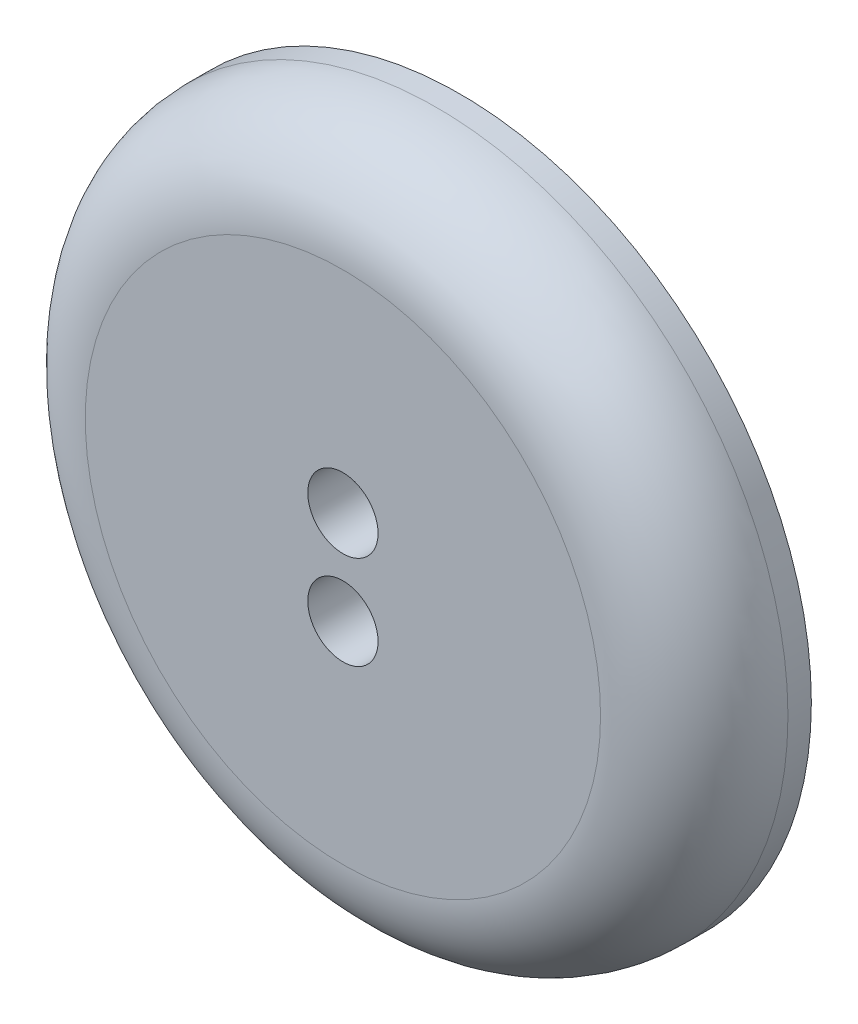
ISO-10303-21;
HEADER;
FILE_DESCRIPTION(('STEP AP214'),'2;1');
FILE_NAME('part.step','',(''),(''),'','','');
FILE_SCHEMA(('AUTOMOTIVE_DESIGN { 1 0 10303 214 1 1 1 1 }'));
ENDSEC;
DATA;
#1=APPLICATION_CONTEXT('core data for automotive mechanical design processes');
#2=APPLICATION_PROTOCOL_DEFINITION('international standard','automotive_design',2000,#1);
#3=PRODUCT_CONTEXT('',#1,'mechanical');
#4=PRODUCT('Part','Part','',(#3));
#5=PRODUCT_RELATED_PRODUCT_CATEGORY('part','',(#4));
#6=PRODUCT_DEFINITION_FORMATION('','',#4);
#7=PRODUCT_DEFINITION_CONTEXT('part definition',#1,'design');
#8=PRODUCT_DEFINITION('design','',#6,#7);
#9=PRODUCT_DEFINITION_SHAPE('','',#8);
#10=(LENGTH_UNIT() NAMED_UNIT(*) SI_UNIT(.MILLI.,.METRE.));
#11=(NAMED_UNIT(*) PLANE_ANGLE_UNIT() SI_UNIT($,.RADIAN.));
#12=(NAMED_UNIT(*) SI_UNIT($,.STERADIAN.) SOLID_ANGLE_UNIT());
#13=UNCERTAINTY_MEASURE_WITH_UNIT(LENGTH_MEASURE(1.E-05),#10,'distance_accuracy_value','');
#14=(GEOMETRIC_REPRESENTATION_CONTEXT(3) GLOBAL_UNCERTAINTY_ASSIGNED_CONTEXT((#13)) GLOBAL_UNIT_ASSIGNED_CONTEXT((#10,
#11,#12)) REPRESENTATION_CONTEXT('',''));
#15=CARTESIAN_POINT('',(0.,0.,0.));
#16=DIRECTION('',(0.,0.,1.));
#17=DIRECTION('',(1.,0.,0.));
#18=AXIS2_PLACEMENT_3D('',#15,#16,#17);
#19=CARTESIAN_POINT('',(0.,0.,5.));
#20=DIRECTION('',(0.,0.,1.));
#21=DIRECTION('',(1.,0.,0.));
#22=AXIS2_PLACEMENT_3D('',#19,#20,#21);
#23=PLANE('',#22);
#24=CARTESIAN_POINT('',(0.,0.,5.));
#25=DIRECTION('',(0.,0.,1.));
#26=DIRECTION('',(1.,0.,0.));
#27=AXIS2_PLACEMENT_3D('',#24,#25,#26);
#28=CIRCLE('',#27,11.);
#29=CARTESIAN_POINT('',(11.,0.,5.));
#30=VERTEX_POINT('',#29);
#31=EDGE_CURVE('E56',#30,#30,#28,.T.);
#32=ORIENTED_EDGE('',*,*,#31,.T.);
#33=EDGE_LOOP('',(#32));
#34=FACE_BOUND('',#33,.T.);
#35=CARTESIAN_POINT('',(0.,2.,5.));
#36=DIRECTION('',(0.,0.,1.));
#37=DIRECTION('',(1.,0.,0.));
#38=AXIS2_PLACEMENT_3D('',#35,#36,#37);
#39=CIRCLE('',#38,1.5);
#40=CARTESIAN_POINT('',(1.5,2.,5.));
#41=VERTEX_POINT('',#40);
#42=EDGE_CURVE('E64',#41,#41,#39,.T.);
#43=ORIENTED_EDGE('',*,*,#42,.F.);
#44=EDGE_LOOP('',(#43));
#45=FACE_BOUND('',#44,.T.);
#46=CARTESIAN_POINT('',(0.,-2.,5.));
#47=DIRECTION('',(0.,0.,1.));
#48=DIRECTION('',(1.,0.,0.));
#49=AXIS2_PLACEMENT_3D('',#46,#47,#48);
#50=CIRCLE('',#49,1.5);
#51=CARTESIAN_POINT('',(1.5,-2.,5.));
#52=VERTEX_POINT('',#51);
#53=EDGE_CURVE('E70',#52,#52,#50,.T.);
#54=ORIENTED_EDGE('',*,*,#53,.F.);
#55=EDGE_LOOP('',(#54));
#56=FACE_BOUND('',#55,.T.);
#57=ADVANCED_FACE('F49',(#34,#45,#56),#23,.T.);
#58=CARTESIAN_POINT('',(0.,0.,0.));
#59=DIRECTION('',(0.,0.,1.));
#60=DIRECTION('',(1.,0.,0.));
#61=AXIS2_PLACEMENT_3D('',#58,#59,#60);
#62=PLANE('',#61);
#63=CARTESIAN_POINT('',(0.,0.,0.));
#64=DIRECTION('',(0.,0.,1.));
#65=DIRECTION('',(1.,0.,0.));
#66=AXIS2_PLACEMENT_3D('',#63,#64,#65);
#67=CIRCLE('',#66,15.);
#68=CARTESIAN_POINT('',(15.,0.,0.));
#69=VERTEX_POINT('',#68);
#70=EDGE_CURVE('E60',#69,#69,#67,.T.);
#71=ORIENTED_EDGE('',*,*,#70,.F.);
#72=EDGE_LOOP('',(#71));
#73=FACE_BOUND('',#72,.T.);
#74=CARTESIAN_POINT('',(0.,2.,0.));
#75=DIRECTION('',(0.,0.,1.));
#76=DIRECTION('',(1.,0.,0.));
#77=AXIS2_PLACEMENT_3D('',#74,#75,#76);
#78=CIRCLE('',#77,1.5);
#79=CARTESIAN_POINT('',(1.5,2.,0.));
#80=VERTEX_POINT('',#79);
#81=EDGE_CURVE('E67',#80,#80,#78,.T.);
#82=ORIENTED_EDGE('',*,*,#81,.T.);
#83=EDGE_LOOP('',(#82));
#84=FACE_BOUND('',#83,.T.);
#85=CARTESIAN_POINT('',(0.,-2.,0.));
#86=DIRECTION('',(0.,0.,1.));
#87=DIRECTION('',(1.,0.,0.));
#88=AXIS2_PLACEMENT_3D('',#85,#86,#87);
#89=CIRCLE('',#88,1.5);
#90=CARTESIAN_POINT('',(1.5,-2.,0.));
#91=VERTEX_POINT('',#90);
#92=EDGE_CURVE('E73',#91,#91,#89,.T.);
#93=ORIENTED_EDGE('',*,*,#92,.T.);
#94=EDGE_LOOP('',(#93));
#95=FACE_BOUND('',#94,.T.);
#96=ADVANCED_FACE('F83',(#73,#84,#95),#62,.F.);
#97=CARTESIAN_POINT('',(0.,0.,5.));
#98=DIRECTION('',(0.,0.,-1.));
#99=DIRECTION('',(-1.,0.,0.));
#100=AXIS2_PLACEMENT_3D('',#97,#98,#99);
#101=CYLINDRICAL_SURFACE('',#100,15.);
#102=CARTESIAN_POINT('',(0.,0.,1.));
#103=DIRECTION('',(0.,0.,1.));
#104=DIRECTION('',(1.,0.,0.));
#105=AXIS2_PLACEMENT_3D('',#102,#103,#104);
#106=CIRCLE('',#105,15.);
#107=CARTESIAN_POINT('',(15.,0.,1.));
#108=VERTEX_POINT('',#107);
#109=EDGE_CURVE('E11',#108,#108,#106,.F.);
#110=ORIENTED_EDGE('',*,*,#109,.T.);
#111=EDGE_LOOP('',(#110));
#112=FACE_BOUND('',#111,.T.);
#113=ORIENTED_EDGE('',*,*,#70,.T.);
#114=EDGE_LOOP('',(#113));
#115=FACE_BOUND('',#114,.T.);
#116=ADVANCED_FACE('F90',(#112,#115),#101,.T.);
#117=CARTESIAN_POINT('',(0.,2.,5.));
#118=DIRECTION('',(0.,0.,-1.));
#119=DIRECTION('',(-1.,0.,0.));
#120=AXIS2_PLACEMENT_3D('',#117,#118,#119);
#121=CYLINDRICAL_SURFACE('',#120,1.5);
#122=ORIENTED_EDGE('',*,*,#42,.T.);
#123=EDGE_LOOP('',(#122));
#124=FACE_BOUND('',#123,.T.);
#125=ORIENTED_EDGE('',*,*,#81,.F.);
#126=EDGE_LOOP('',(#125));
#127=FACE_BOUND('',#126,.T.);
#128=ADVANCED_FACE('F95',(#124,#127),#121,.F.);
#129=CARTESIAN_POINT('',(0.,-2.,5.));
#130=DIRECTION('',(0.,0.,-1.));
#131=DIRECTION('',(-1.,0.,0.));
#132=AXIS2_PLACEMENT_3D('',#129,#130,#131);
#133=CYLINDRICAL_SURFACE('',#132,1.5);
#134=ORIENTED_EDGE('',*,*,#53,.T.);
#135=EDGE_LOOP('',(#134));
#136=FACE_BOUND('',#135,.T.);
#137=ORIENTED_EDGE('',*,*,#92,.F.);
#138=EDGE_LOOP('',(#137));
#139=FACE_BOUND('',#138,.T.);
#140=ADVANCED_FACE('F79',(#136,#139),#133,.F.);
#141=CARTESIAN_POINT('',(0.,0.,1.));
#142=DIRECTION('',(0.,0.,1.));
#143=DIRECTION('',(1.,0.,0.));
#144=AXIS2_PLACEMENT_3D('',#141,#142,#143);
#145=TOROIDAL_SURFACE('',#144,11.,4.);
#146=ORIENTED_EDGE('',*,*,#109,.F.);
#147=EDGE_LOOP('',(#146));
#148=FACE_BOUND('',#147,.T.);
#149=ORIENTED_EDGE('',*,*,#31,.F.);
#150=EDGE_LOOP('',(#149));
#151=FACE_BOUND('',#150,.T.);
#152=ADVANCED_FACE('F51',(#148,#151),#145,.T.);
#153=CLOSED_SHELL('',(#57,#96,#116,#128,#140,#152));
#154=MANIFOLD_SOLID_BREP('B2',#153);
#155=ADVANCED_BREP_SHAPE_REPRESENTATION('',(#18,#154),#14);
#156=SHAPE_DEFINITION_REPRESENTATION(#9,#155);
ENDSEC;
END-ISO-10303-21;
